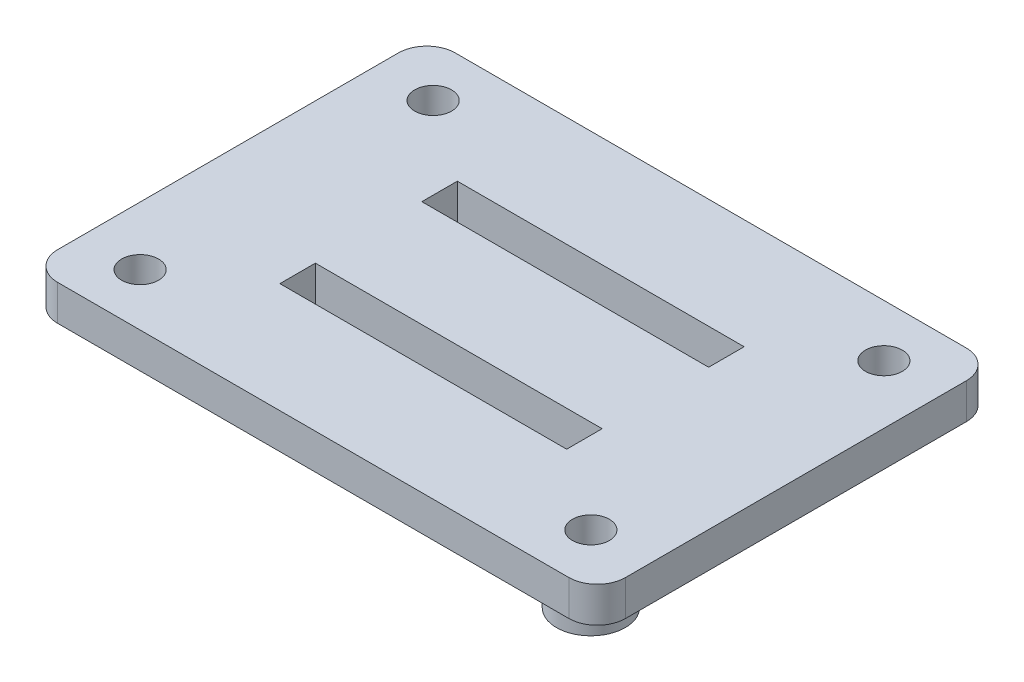
ISO-10303-21;
HEADER;
FILE_DESCRIPTION(('STEP AP214'),'2;1');
FILE_NAME('part.step','',(''),(''),'','','');
FILE_SCHEMA(('AUTOMOTIVE_DESIGN { 1 0 10303 214 1 1 1 1 }'));
ENDSEC;
DATA;
#1=APPLICATION_CONTEXT('core data for automotive mechanical design processes');
#2=APPLICATION_PROTOCOL_DEFINITION('international standard','automotive_design',2000,#1);
#3=PRODUCT_CONTEXT('',#1,'mechanical');
#4=PRODUCT('Part','Part','',(#3));
#5=PRODUCT_RELATED_PRODUCT_CATEGORY('part','',(#4));
#6=PRODUCT_DEFINITION_FORMATION('','',#4);
#7=PRODUCT_DEFINITION_CONTEXT('part definition',#1,'design');
#8=PRODUCT_DEFINITION('design','',#6,#7);
#9=PRODUCT_DEFINITION_SHAPE('','',#8);
#10=(LENGTH_UNIT() NAMED_UNIT(*) SI_UNIT(.MILLI.,.METRE.));
#11=(NAMED_UNIT(*) PLANE_ANGLE_UNIT() SI_UNIT($,.RADIAN.));
#12=(NAMED_UNIT(*) SI_UNIT($,.STERADIAN.) SOLID_ANGLE_UNIT());
#13=UNCERTAINTY_MEASURE_WITH_UNIT(LENGTH_MEASURE(1.E-05),#10,'distance_accuracy_value','');
#14=(GEOMETRIC_REPRESENTATION_CONTEXT(3) GLOBAL_UNCERTAINTY_ASSIGNED_CONTEXT((#13)) GLOBAL_UNIT_ASSIGNED_CONTEXT((#10,
#11,#12)) REPRESENTATION_CONTEXT('',''));
#15=CARTESIAN_POINT('',(0.,0.,0.));
#16=DIRECTION('',(0.,0.,1.));
#17=DIRECTION('',(1.,0.,0.));
#18=AXIS2_PLACEMENT_3D('',#15,#16,#17);
#19=CARTESIAN_POINT('',(40.,5.,28.));
#20=DIRECTION('',(-1.,0.,0.));
#21=DIRECTION('',(0.,0.,1.));
#22=AXIS2_PLACEMENT_3D('',#19,#20,#21);
#23=PLANE('',#22);
#24=DIRECTION('',(0.,0.,-1.));
#25=VECTOR('',#24,1.);
#26=CARTESIAN_POINT('',(40.,0.,28.));
#27=LINE('',#26,#25);
#28=CARTESIAN_POINT('',(40.,0.,24.));
#29=VERTEX_POINT('',#28);
#30=CARTESIAN_POINT('',(40.,0.,-24.));
#31=VERTEX_POINT('',#30);
#32=EDGE_CURVE('E246',#29,#31,#27,.T.);
#33=ORIENTED_EDGE('',*,*,#32,.T.);
#34=DIRECTION('',(0.,-1.,0.));
#35=VECTOR('',#34,1.);
#36=CARTESIAN_POINT('',(40.,5.,-24.));
#37=LINE('',#36,#35);
#38=CARTESIAN_POINT('',(40.,5.,-24.));
#39=VERTEX_POINT('',#38);
#40=EDGE_CURVE('E295',#31,#39,#37,.F.);
#41=ORIENTED_EDGE('',*,*,#40,.T.);
#42=DIRECTION('',(0.,0.,-1.));
#43=VECTOR('',#42,1.);
#44=CARTESIAN_POINT('',(40.,5.,28.));
#45=LINE('',#44,#43);
#46=CARTESIAN_POINT('',(40.,5.,24.));
#47=VERTEX_POINT('',#46);
#48=EDGE_CURVE('E247',#47,#39,#45,.T.);
#49=ORIENTED_EDGE('',*,*,#48,.F.);
#50=DIRECTION('',(0.,-1.,0.));
#51=VECTOR('',#50,1.);
#52=CARTESIAN_POINT('',(40.,5.,24.));
#53=LINE('',#52,#51);
#54=EDGE_CURVE('E292',#47,#29,#53,.T.);
#55=ORIENTED_EDGE('',*,*,#54,.T.);
#56=EDGE_LOOP('',(#33,#41,#49,#55));
#57=FACE_BOUND('',#56,.T.);
#58=ADVANCED_FACE('F45',(#57),#23,.F.);
#59=CARTESIAN_POINT('',(-40.,5.,-28.));
#60=DIRECTION('',(0.,0.,1.));
#61=DIRECTION('',(1.,0.,0.));
#62=AXIS2_PLACEMENT_3D('',#59,#60,#61);
#63=PLANE('',#62);
#64=DIRECTION('',(-1.,0.,0.));
#65=VECTOR('',#64,1.);
#66=CARTESIAN_POINT('',(-40.,0.,-28.));
#67=LINE('',#66,#65);
#68=CARTESIAN_POINT('',(36.,0.,-28.));
#69=VERTEX_POINT('',#68);
#70=CARTESIAN_POINT('',(-36.,0.,-28.));
#71=VERTEX_POINT('',#70);
#72=EDGE_CURVE('E261',#69,#71,#67,.T.);
#73=ORIENTED_EDGE('',*,*,#72,.T.);
#74=DIRECTION('',(0.,-1.,0.));
#75=VECTOR('',#74,1.);
#76=CARTESIAN_POINT('',(-36.,5.,-28.));
#77=LINE('',#76,#75);
#78=CARTESIAN_POINT('',(-36.,5.,-28.));
#79=VERTEX_POINT('',#78);
#80=EDGE_CURVE('E283',#71,#79,#77,.F.);
#81=ORIENTED_EDGE('',*,*,#80,.T.);
#82=DIRECTION('',(-1.,0.,0.));
#83=VECTOR('',#82,1.);
#84=CARTESIAN_POINT('',(-40.,5.,-28.));
#85=LINE('',#84,#83);
#86=CARTESIAN_POINT('',(36.,5.,-28.));
#87=VERTEX_POINT('',#86);
#88=EDGE_CURVE('E250',#87,#79,#85,.T.);
#89=ORIENTED_EDGE('',*,*,#88,.F.);
#90=DIRECTION('',(0.,-1.,0.));
#91=VECTOR('',#90,1.);
#92=CARTESIAN_POINT('',(36.,5.,-28.));
#93=LINE('',#92,#91);
#94=EDGE_CURVE('E280',#87,#69,#93,.T.);
#95=ORIENTED_EDGE('',*,*,#94,.T.);
#96=EDGE_LOOP('',(#73,#81,#89,#95));
#97=FACE_BOUND('',#96,.T.);
#98=ADVANCED_FACE('F319',(#97),#63,.F.);
#99=CARTESIAN_POINT('',(-40.,5.,28.));
#100=DIRECTION('',(1.,0.,0.));
#101=DIRECTION('',(0.,0.,-1.));
#102=AXIS2_PLACEMENT_3D('',#99,#100,#101);
#103=PLANE('',#102);
#104=DIRECTION('',(0.,0.,1.));
#105=VECTOR('',#104,1.);
#106=CARTESIAN_POINT('',(-40.,5.,28.));
#107=LINE('',#106,#105);
#108=CARTESIAN_POINT('',(-40.,5.,-24.));
#109=VERTEX_POINT('',#108);
#110=CARTESIAN_POINT('',(-40.,5.,24.));
#111=VERTEX_POINT('',#110);
#112=EDGE_CURVE('E254',#109,#111,#107,.T.);
#113=ORIENTED_EDGE('',*,*,#112,.F.);
#114=DIRECTION('',(0.,-1.,0.));
#115=VECTOR('',#114,1.);
#116=CARTESIAN_POINT('',(-40.,5.,-24.));
#117=LINE('',#116,#115);
#118=CARTESIAN_POINT('',(-40.,0.,-24.));
#119=VERTEX_POINT('',#118);
#120=EDGE_CURVE('E269',#109,#119,#117,.T.);
#121=ORIENTED_EDGE('',*,*,#120,.T.);
#122=DIRECTION('',(0.,0.,1.));
#123=VECTOR('',#122,1.);
#124=CARTESIAN_POINT('',(-40.,0.,28.));
#125=LINE('',#124,#123);
#126=CARTESIAN_POINT('',(-40.,0.,24.));
#127=VERTEX_POINT('',#126);
#128=EDGE_CURVE('E264',#119,#127,#125,.T.);
#129=ORIENTED_EDGE('',*,*,#128,.T.);
#130=DIRECTION('',(0.,-1.,0.));
#131=VECTOR('',#130,1.);
#132=CARTESIAN_POINT('',(-40.,5.,24.));
#133=LINE('',#132,#131);
#134=EDGE_CURVE('E258',#127,#111,#133,.F.);
#135=ORIENTED_EDGE('',*,*,#134,.T.);
#136=EDGE_LOOP('',(#113,#121,#129,#135));
#137=FACE_BOUND('',#136,.T.);
#138=ADVANCED_FACE('F327',(#137),#103,.F.);
#139=CARTESIAN_POINT('',(-40.,5.,28.));
#140=DIRECTION('',(0.,0.,-1.));
#141=DIRECTION('',(-1.,0.,0.));
#142=AXIS2_PLACEMENT_3D('',#139,#140,#141);
#143=PLANE('',#142);
#144=DIRECTION('',(1.,0.,0.));
#145=VECTOR('',#144,1.);
#146=CARTESIAN_POINT('',(-40.,0.,28.));
#147=LINE('',#146,#145);
#148=CARTESIAN_POINT('',(-36.,0.,28.));
#149=VERTEX_POINT('',#148);
#150=CARTESIAN_POINT('',(36.,0.,28.));
#151=VERTEX_POINT('',#150);
#152=EDGE_CURVE('E251',#149,#151,#147,.T.);
#153=ORIENTED_EDGE('',*,*,#152,.T.);
#154=DIRECTION('',(0.,-1.,0.));
#155=VECTOR('',#154,1.);
#156=CARTESIAN_POINT('',(36.,5.,28.));
#157=LINE('',#156,#155);
#158=CARTESIAN_POINT('',(36.,5.,28.));
#159=VERTEX_POINT('',#158);
#160=EDGE_CURVE('E11',#151,#159,#157,.F.);
#161=ORIENTED_EDGE('',*,*,#160,.T.);
#162=DIRECTION('',(1.,0.,0.));
#163=VECTOR('',#162,1.);
#164=CARTESIAN_POINT('',(-40.,5.,28.));
#165=LINE('',#164,#163);
#166=CARTESIAN_POINT('',(-36.,5.,28.));
#167=VERTEX_POINT('',#166);
#168=EDGE_CURVE('E256',#167,#159,#165,.T.);
#169=ORIENTED_EDGE('',*,*,#168,.F.);
#170=DIRECTION('',(0.,-1.,0.));
#171=VECTOR('',#170,1.);
#172=CARTESIAN_POINT('',(-36.,5.,28.));
#173=LINE('',#172,#171);
#174=EDGE_CURVE('E53',#167,#149,#173,.T.);
#175=ORIENTED_EDGE('',*,*,#174,.T.);
#176=EDGE_LOOP('',(#153,#161,#169,#175));
#177=FACE_BOUND('',#176,.T.);
#178=ADVANCED_FACE('F299',(#177),#143,.F.);
#179=CARTESIAN_POINT('',(0.,5.,0.));
#180=DIRECTION('',(0.,-1.,0.));
#181=DIRECTION('',(0.,0.,-1.));
#182=AXIS2_PLACEMENT_3D('',#179,#180,#181);
#183=PLANE('',#182);
#184=DIRECTION('',(-1.,0.,0.));
#185=VECTOR('',#184,1.);
#186=CARTESIAN_POINT('',(-20.2,5.,-7.5));
#187=LINE('',#186,#185);
#188=CARTESIAN_POINT('',(20.2,5.,-7.5));
#189=VERTEX_POINT('',#188);
#190=CARTESIAN_POINT('',(-20.2,5.,-7.5));
#191=VERTEX_POINT('',#190);
#192=EDGE_CURVE('E196',#189,#191,#187,.T.);
#193=ORIENTED_EDGE('',*,*,#192,.T.);
#194=DIRECTION('',(0.,0.,-1.));
#195=VECTOR('',#194,1.);
#196=CARTESIAN_POINT('',(-20.2,5.,-12.5));
#197=LINE('',#196,#195);
#198=CARTESIAN_POINT('',(-20.2,5.,-12.5));
#199=VERTEX_POINT('',#198);
#200=EDGE_CURVE('E200',#191,#199,#197,.T.);
#201=ORIENTED_EDGE('',*,*,#200,.T.);
#202=DIRECTION('',(1.,0.,0.));
#203=VECTOR('',#202,1.);
#204=CARTESIAN_POINT('',(-20.2,5.,-12.5));
#205=LINE('',#204,#203);
#206=CARTESIAN_POINT('',(20.2,5.,-12.5));
#207=VERTEX_POINT('',#206);
#208=EDGE_CURVE('E223',#199,#207,#205,.T.);
#209=ORIENTED_EDGE('',*,*,#208,.T.);
#210=DIRECTION('',(0.,0.,1.));
#211=VECTOR('',#210,1.);
#212=CARTESIAN_POINT('',(20.2,5.,-12.5));
#213=LINE('',#212,#211);
#214=EDGE_CURVE('E220',#207,#189,#213,.T.);
#215=ORIENTED_EDGE('',*,*,#214,.T.);
#216=EDGE_LOOP('',(#193,#201,#209,#215));
#217=FACE_BOUND('',#216,.T.);
#218=CARTESIAN_POINT('',(-31.75,5.,20.6375));
#219=DIRECTION('',(0.,-1.,0.));
#220=DIRECTION('',(0.,0.,-1.));
#221=AXIS2_PLACEMENT_3D('',#218,#219,#220);
#222=CIRCLE('',#221,2.6);
#223=CARTESIAN_POINT('',(-31.75,5.,18.0375));
#224=VERTEX_POINT('',#223);
#225=EDGE_CURVE('E188',#224,#224,#222,.T.);
#226=ORIENTED_EDGE('',*,*,#225,.T.);
#227=EDGE_LOOP('',(#226));
#228=FACE_BOUND('',#227,.T.);
#229=CARTESIAN_POINT('',(31.75,5.,20.6375));
#230=DIRECTION('',(0.,-1.,0.));
#231=DIRECTION('',(0.,0.,-1.));
#232=AXIS2_PLACEMENT_3D('',#229,#230,#231);
#233=CIRCLE('',#232,2.6);
#234=CARTESIAN_POINT('',(31.75,5.,18.0375));
#235=VERTEX_POINT('',#234);
#236=EDGE_CURVE('E195',#235,#235,#233,.T.);
#237=ORIENTED_EDGE('',*,*,#236,.T.);
#238=EDGE_LOOP('',(#237));
#239=FACE_BOUND('',#238,.T.);
#240=CARTESIAN_POINT('',(-31.75,5.,-20.6375));
#241=DIRECTION('',(0.,-1.,0.));
#242=DIRECTION('',(0.,0.,-1.));
#243=AXIS2_PLACEMENT_3D('',#240,#241,#242);
#244=CIRCLE('',#243,2.6);
#245=CARTESIAN_POINT('',(-31.75,5.,-23.2375));
#246=VERTEX_POINT('',#245);
#247=EDGE_CURVE('E229',#246,#246,#244,.T.);
#248=ORIENTED_EDGE('',*,*,#247,.T.);
#249=EDGE_LOOP('',(#248));
#250=FACE_BOUND('',#249,.T.);
#251=DIRECTION('',(1.,0.,0.));
#252=VECTOR('',#251,1.);
#253=CARTESIAN_POINT('',(-20.2,5.,7.5));
#254=LINE('',#253,#252);
#255=CARTESIAN_POINT('',(-20.2,5.,7.5));
#256=VERTEX_POINT('',#255);
#257=CARTESIAN_POINT('',(20.2,5.,7.5));
#258=VERTEX_POINT('',#257);
#259=EDGE_CURVE('E183',#256,#258,#254,.T.);
#260=ORIENTED_EDGE('',*,*,#259,.T.);
#261=DIRECTION('',(0.,0.,1.));
#262=VECTOR('',#261,1.);
#263=CARTESIAN_POINT('',(20.2,5.,12.5));
#264=LINE('',#263,#262);
#265=CARTESIAN_POINT('',(20.2,5.,12.5));
#266=VERTEX_POINT('',#265);
#267=EDGE_CURVE('E168',#258,#266,#264,.T.);
#268=ORIENTED_EDGE('',*,*,#267,.T.);
#269=DIRECTION('',(-1.,0.,0.));
#270=VECTOR('',#269,1.);
#271=CARTESIAN_POINT('',(-20.2,5.,12.5));
#272=LINE('',#271,#270);
#273=CARTESIAN_POINT('',(-20.2,5.,12.5));
#274=VERTEX_POINT('',#273);
#275=EDGE_CURVE('E158',#266,#274,#272,.T.);
#276=ORIENTED_EDGE('',*,*,#275,.T.);
#277=DIRECTION('',(0.,0.,-1.));
#278=VECTOR('',#277,1.);
#279=CARTESIAN_POINT('',(-20.2,5.,12.5));
#280=LINE('',#279,#278);
#281=EDGE_CURVE('E169',#274,#256,#280,.T.);
#282=ORIENTED_EDGE('',*,*,#281,.T.);
#283=EDGE_LOOP('',(#260,#268,#276,#282));
#284=FACE_BOUND('',#283,.T.);
#285=CARTESIAN_POINT('',(31.75,5.,-20.6375));
#286=DIRECTION('',(0.,-1.,0.));
#287=DIRECTION('',(0.,0.,-1.));
#288=AXIS2_PLACEMENT_3D('',#285,#286,#287);
#289=CIRCLE('',#288,2.6);
#290=CARTESIAN_POINT('',(31.75,5.,-23.2375));
#291=VERTEX_POINT('',#290);
#292=EDGE_CURVE('E243',#291,#291,#289,.T.);
#293=ORIENTED_EDGE('',*,*,#292,.T.);
#294=EDGE_LOOP('',(#293));
#295=FACE_BOUND('',#294,.T.);
#296=ORIENTED_EDGE('',*,*,#88,.T.);
#297=CARTESIAN_POINT('',(-36.,5.,-24.));
#298=DIRECTION('',(0.,-1.,0.));
#299=DIRECTION('',(0.,0.,-1.));
#300=AXIS2_PLACEMENT_3D('',#297,#298,#299);
#301=CIRCLE('',#300,4.);
#302=EDGE_CURVE('E290',#79,#109,#301,.F.);
#303=ORIENTED_EDGE('',*,*,#302,.T.);
#304=ORIENTED_EDGE('',*,*,#112,.T.);
#305=CARTESIAN_POINT('',(-36.,5.,24.));
#306=DIRECTION('',(0.,-1.,0.));
#307=DIRECTION('',(0.,0.,-1.));
#308=AXIS2_PLACEMENT_3D('',#305,#306,#307);
#309=CIRCLE('',#308,4.);
#310=EDGE_CURVE('E65',#111,#167,#309,.F.);
#311=ORIENTED_EDGE('',*,*,#310,.T.);
#312=ORIENTED_EDGE('',*,*,#168,.T.);
#313=CARTESIAN_POINT('',(36.,5.,24.));
#314=DIRECTION('',(0.,-1.,0.));
#315=DIRECTION('',(0.,0.,-1.));
#316=AXIS2_PLACEMENT_3D('',#313,#314,#315);
#317=CIRCLE('',#316,4.);
#318=EDGE_CURVE('E286',#159,#47,#317,.F.);
#319=ORIENTED_EDGE('',*,*,#318,.T.);
#320=ORIENTED_EDGE('',*,*,#48,.T.);
#321=CARTESIAN_POINT('',(36.,5.,-24.));
#322=DIRECTION('',(0.,-1.,0.));
#323=DIRECTION('',(0.,0.,-1.));
#324=AXIS2_PLACEMENT_3D('',#321,#322,#323);
#325=CIRCLE('',#324,4.);
#326=EDGE_CURVE('E288',#39,#87,#325,.F.);
#327=ORIENTED_EDGE('',*,*,#326,.T.);
#328=EDGE_LOOP('',(#296,#303,#304,#311,#312,#319,#320,#327));
#329=FACE_BOUND('',#328,.T.);
#330=ADVANCED_FACE('F180',(#217,#228,#239,#250,#284,#295,#329),#183,.F.);
#331=CARTESIAN_POINT('',(0.,0.,0.));
#332=DIRECTION('',(0.,-1.,0.));
#333=DIRECTION('',(0.,0.,-1.));
#334=AXIS2_PLACEMENT_3D('',#331,#332,#333);
#335=PLANE('',#334);
#336=CARTESIAN_POINT('',(31.75,0.,20.6375));
#337=DIRECTION('',(0.,-1.,0.));
#338=DIRECTION('',(0.,0.,-1.));
#339=AXIS2_PLACEMENT_3D('',#336,#337,#338);
#340=CIRCLE('',#339,4.85);
#341=CARTESIAN_POINT('',(31.75,0.,15.7875));
#342=VERTEX_POINT('',#341);
#343=EDGE_CURVE('E567',#342,#342,#340,.T.);
#344=ORIENTED_EDGE('',*,*,#343,.F.);
#345=EDGE_LOOP('',(#344));
#346=FACE_BOUND('',#345,.T.);
#347=DIRECTION('',(0.,0.,1.));
#348=VECTOR('',#347,1.);
#349=CARTESIAN_POINT('',(-20.2,0.,-12.5));
#350=LINE('',#349,#348);
#351=CARTESIAN_POINT('',(-20.2,0.,-12.5));
#352=VERTEX_POINT('',#351);
#353=CARTESIAN_POINT('',(-20.2,0.,-7.5));
#354=VERTEX_POINT('',#353);
#355=EDGE_CURVE('E212',#352,#354,#350,.T.);
#356=ORIENTED_EDGE('',*,*,#355,.T.);
#357=DIRECTION('',(1.,0.,0.));
#358=VECTOR('',#357,1.);
#359=CARTESIAN_POINT('',(-20.2,0.,-7.5));
#360=LINE('',#359,#358);
#361=CARTESIAN_POINT('',(20.2,0.,-7.5));
#362=VERTEX_POINT('',#361);
#363=EDGE_CURVE('E209',#354,#362,#360,.T.);
#364=ORIENTED_EDGE('',*,*,#363,.T.);
#365=DIRECTION('',(0.,0.,-1.));
#366=VECTOR('',#365,1.);
#367=CARTESIAN_POINT('',(20.2,0.,-12.5));
#368=LINE('',#367,#366);
#369=CARTESIAN_POINT('',(20.2,0.,-12.5));
#370=VERTEX_POINT('',#369);
#371=EDGE_CURVE('E192',#362,#370,#368,.T.);
#372=ORIENTED_EDGE('',*,*,#371,.T.);
#373=DIRECTION('',(-1.,0.,0.));
#374=VECTOR('',#373,1.);
#375=CARTESIAN_POINT('',(-20.2,0.,-12.5));
#376=LINE('',#375,#374);
#377=EDGE_CURVE('E215',#370,#352,#376,.T.);
#378=ORIENTED_EDGE('',*,*,#377,.T.);
#379=EDGE_LOOP('',(#356,#364,#372,#378));
#380=FACE_BOUND('',#379,.T.);
#381=CARTESIAN_POINT('',(-31.75,0.,20.6375));
#382=DIRECTION('',(0.,1.,0.));
#383=DIRECTION('',(0.,0.,-1.));
#384=AXIS2_PLACEMENT_3D('',#381,#382,#383);
#385=CIRCLE('',#384,2.6);
#386=CARTESIAN_POINT('',(-31.75,0.,18.0375));
#387=VERTEX_POINT('',#386);
#388=EDGE_CURVE('E191',#387,#387,#385,.T.);
#389=ORIENTED_EDGE('',*,*,#388,.T.);
#390=EDGE_LOOP('',(#389));
#391=FACE_BOUND('',#390,.T.);
#392=CARTESIAN_POINT('',(-31.75,0.,-20.6375));
#393=DIRECTION('',(0.,1.,0.));
#394=DIRECTION('',(0.,0.,1.));
#395=AXIS2_PLACEMENT_3D('',#392,#393,#394);
#396=CIRCLE('',#395,2.6);
#397=CARTESIAN_POINT('',(-31.75,0.,-18.0375));
#398=VERTEX_POINT('',#397);
#399=EDGE_CURVE('E232',#398,#398,#396,.T.);
#400=ORIENTED_EDGE('',*,*,#399,.T.);
#401=EDGE_LOOP('',(#400));
#402=FACE_BOUND('',#401,.T.);
#403=DIRECTION('',(0.,0.,-1.));
#404=VECTOR('',#403,1.);
#405=CARTESIAN_POINT('',(20.2,0.,12.5));
#406=LINE('',#405,#404);
#407=CARTESIAN_POINT('',(20.2,0.,12.5));
#408=VERTEX_POINT('',#407);
#409=CARTESIAN_POINT('',(20.2,0.,7.5));
#410=VERTEX_POINT('',#409);
#411=EDGE_CURVE('E175',#408,#410,#406,.T.);
#412=ORIENTED_EDGE('',*,*,#411,.T.);
#413=DIRECTION('',(-1.,0.,0.));
#414=VECTOR('',#413,1.);
#415=CARTESIAN_POINT('',(-20.2,0.,7.5));
#416=LINE('',#415,#414);
#417=CARTESIAN_POINT('',(-20.2,0.,7.5));
#418=VERTEX_POINT('',#417);
#419=EDGE_CURVE('E557',#410,#418,#416,.T.);
#420=ORIENTED_EDGE('',*,*,#419,.T.);
#421=DIRECTION('',(0.,0.,1.));
#422=VECTOR('',#421,1.);
#423=CARTESIAN_POINT('',(-20.2,0.,12.5));
#424=LINE('',#423,#422);
#425=CARTESIAN_POINT('',(-20.2,0.,12.5));
#426=VERTEX_POINT('',#425);
#427=EDGE_CURVE('E224',#418,#426,#424,.T.);
#428=ORIENTED_EDGE('',*,*,#427,.T.);
#429=DIRECTION('',(1.,0.,0.));
#430=VECTOR('',#429,1.);
#431=CARTESIAN_POINT('',(-20.2,0.,12.5));
#432=LINE('',#431,#430);
#433=EDGE_CURVE('E558',#426,#408,#432,.T.);
#434=ORIENTED_EDGE('',*,*,#433,.T.);
#435=EDGE_LOOP('',(#412,#420,#428,#434));
#436=FACE_BOUND('',#435,.T.);
#437=CARTESIAN_POINT('',(31.75,0.,-20.6375));
#438=DIRECTION('',(0.,1.,0.));
#439=DIRECTION('',(0.,0.,-1.));
#440=AXIS2_PLACEMENT_3D('',#437,#438,#439);
#441=CIRCLE('',#440,2.6);
#442=CARTESIAN_POINT('',(31.75,0.,-23.2375));
#443=VERTEX_POINT('',#442);
#444=EDGE_CURVE('E236',#443,#443,#441,.T.);
#445=ORIENTED_EDGE('',*,*,#444,.T.);
#446=EDGE_LOOP('',(#445));
#447=FACE_BOUND('',#446,.T.);
#448=ORIENTED_EDGE('',*,*,#128,.F.);
#449=CARTESIAN_POINT('',(-36.,0.,-24.));
#450=DIRECTION('',(0.,-1.,0.));
#451=DIRECTION('',(0.,0.,-1.));
#452=AXIS2_PLACEMENT_3D('',#449,#450,#451);
#453=CIRCLE('',#452,4.);
#454=EDGE_CURVE('E278',#119,#71,#453,.T.);
#455=ORIENTED_EDGE('',*,*,#454,.T.);
#456=ORIENTED_EDGE('',*,*,#72,.F.);
#457=CARTESIAN_POINT('',(36.,0.,-24.));
#458=DIRECTION('',(0.,-1.,0.));
#459=DIRECTION('',(0.,0.,-1.));
#460=AXIS2_PLACEMENT_3D('',#457,#458,#459);
#461=CIRCLE('',#460,4.);
#462=EDGE_CURVE('E276',#69,#31,#461,.T.);
#463=ORIENTED_EDGE('',*,*,#462,.T.);
#464=ORIENTED_EDGE('',*,*,#32,.F.);
#465=CARTESIAN_POINT('',(36.,0.,24.));
#466=DIRECTION('',(0.,-1.,0.));
#467=DIRECTION('',(0.,0.,-1.));
#468=AXIS2_PLACEMENT_3D('',#465,#466,#467);
#469=CIRCLE('',#468,4.);
#470=EDGE_CURVE('E274',#29,#151,#469,.T.);
#471=ORIENTED_EDGE('',*,*,#470,.T.);
#472=ORIENTED_EDGE('',*,*,#152,.F.);
#473=CARTESIAN_POINT('',(-36.,0.,24.));
#474=DIRECTION('',(0.,-1.,0.));
#475=DIRECTION('',(0.,0.,-1.));
#476=AXIS2_PLACEMENT_3D('',#473,#474,#475);
#477=CIRCLE('',#476,4.);
#478=EDGE_CURVE('E272',#149,#127,#477,.T.);
#479=ORIENTED_EDGE('',*,*,#478,.T.);
#480=EDGE_LOOP('',(#448,#455,#456,#463,#464,#471,#472,#479));
#481=FACE_BOUND('',#480,.T.);
#482=ADVANCED_FACE('F303',(#346,#380,#391,#402,#436,#447,#481),#335,.T.);
#483=CARTESIAN_POINT('',(31.75,45.708230126106,-20.6375));
#484=DIRECTION('',(0.,-1.,0.));
#485=DIRECTION('',(0.,0.,-1.));
#486=AXIS2_PLACEMENT_3D('',#483,#484,#485);
#487=CYLINDRICAL_SURFACE('',#486,2.6);
#488=ORIENTED_EDGE('',*,*,#292,.F.);
#489=EDGE_LOOP('',(#488));
#490=FACE_BOUND('',#489,.T.);
#491=ORIENTED_EDGE('',*,*,#444,.F.);
#492=EDGE_LOOP('',(#491));
#493=FACE_BOUND('',#492,.T.);
#494=ADVANCED_FACE('F486',(#490,#493),#487,.F.);
#495=CARTESIAN_POINT('',(-20.2,45.708230126106,7.5));
#496=DIRECTION('',(0.,0.,1.));
#497=DIRECTION('',(1.,0.,0.));
#498=AXIS2_PLACEMENT_3D('',#495,#496,#497);
#499=PLANE('',#498);
#500=DIRECTION('',(0.,-1.,0.));
#501=VECTOR('',#500,1.);
#502=CARTESIAN_POINT('',(-20.2,45.708230126106,7.5));
#503=LINE('',#502,#501);
#504=EDGE_CURVE('E561',#256,#418,#503,.T.);
#505=ORIENTED_EDGE('',*,*,#504,.T.);
#506=ORIENTED_EDGE('',*,*,#419,.F.);
#507=DIRECTION('',(0.,-1.,0.));
#508=VECTOR('',#507,1.);
#509=CARTESIAN_POINT('',(20.2,45.708230126106,7.5));
#510=LINE('',#509,#508);
#511=EDGE_CURVE('E177',#258,#410,#510,.T.);
#512=ORIENTED_EDGE('',*,*,#511,.F.);
#513=ORIENTED_EDGE('',*,*,#259,.F.);
#514=EDGE_LOOP('',(#505,#506,#512,#513));
#515=FACE_BOUND('',#514,.T.);
#516=ADVANCED_FACE('F478',(#515),#499,.T.);
#517=CARTESIAN_POINT('',(20.2,45.708230126106,12.5));
#518=DIRECTION('',(-1.,0.,0.));
#519=DIRECTION('',(0.,0.,1.));
#520=AXIS2_PLACEMENT_3D('',#517,#518,#519);
#521=PLANE('',#520);
#522=ORIENTED_EDGE('',*,*,#511,.T.);
#523=ORIENTED_EDGE('',*,*,#411,.F.);
#524=DIRECTION('',(0.,-1.,0.));
#525=VECTOR('',#524,1.);
#526=CARTESIAN_POINT('',(20.2,45.708230126106,12.5));
#527=LINE('',#526,#525);
#528=EDGE_CURVE('E161',#266,#408,#527,.T.);
#529=ORIENTED_EDGE('',*,*,#528,.F.);
#530=ORIENTED_EDGE('',*,*,#267,.F.);
#531=EDGE_LOOP('',(#522,#523,#529,#530));
#532=FACE_BOUND('',#531,.T.);
#533=ADVANCED_FACE('F172',(#532),#521,.T.);
#534=CARTESIAN_POINT('',(-20.2,45.708230126106,12.5));
#535=DIRECTION('',(0.,0.,-1.));
#536=DIRECTION('',(-1.,0.,0.));
#537=AXIS2_PLACEMENT_3D('',#534,#535,#536);
#538=PLANE('',#537);
#539=ORIENTED_EDGE('',*,*,#528,.T.);
#540=ORIENTED_EDGE('',*,*,#433,.F.);
#541=DIRECTION('',(0.,-1.,0.));
#542=VECTOR('',#541,1.);
#543=CARTESIAN_POINT('',(-20.2,45.708230126106,12.5));
#544=LINE('',#543,#542);
#545=EDGE_CURVE('E164',#274,#426,#544,.T.);
#546=ORIENTED_EDGE('',*,*,#545,.F.);
#547=ORIENTED_EDGE('',*,*,#275,.F.);
#548=EDGE_LOOP('',(#539,#540,#546,#547));
#549=FACE_BOUND('',#548,.T.);
#550=ADVANCED_FACE('F160',(#549),#538,.T.);
#551=CARTESIAN_POINT('',(-20.2,45.708230126106,12.5));
#552=DIRECTION('',(1.,0.,0.));
#553=DIRECTION('',(0.,0.,-1.));
#554=AXIS2_PLACEMENT_3D('',#551,#552,#553);
#555=PLANE('',#554);
#556=ORIENTED_EDGE('',*,*,#545,.T.);
#557=ORIENTED_EDGE('',*,*,#427,.F.);
#558=ORIENTED_EDGE('',*,*,#504,.F.);
#559=ORIENTED_EDGE('',*,*,#281,.F.);
#560=EDGE_LOOP('',(#556,#557,#558,#559));
#561=FACE_BOUND('',#560,.T.);
#562=ADVANCED_FACE('F454',(#561),#555,.T.);
#563=CARTESIAN_POINT('',(-31.75,45.708230126106,-20.6375));
#564=DIRECTION('',(0.,-1.,0.));
#565=DIRECTION('',(0.,0.,-1.));
#566=AXIS2_PLACEMENT_3D('',#563,#564,#565);
#567=CYLINDRICAL_SURFACE('',#566,2.6);
#568=ORIENTED_EDGE('',*,*,#247,.F.);
#569=EDGE_LOOP('',(#568));
#570=FACE_BOUND('',#569,.T.);
#571=ORIENTED_EDGE('',*,*,#399,.F.);
#572=EDGE_LOOP('',(#571));
#573=FACE_BOUND('',#572,.T.);
#574=ADVANCED_FACE('F445',(#570,#573),#567,.F.);
#575=CARTESIAN_POINT('',(31.75,45.708230126106,20.6375));
#576=DIRECTION('',(0.,-1.,0.));
#577=DIRECTION('',(0.,0.,-1.));
#578=AXIS2_PLACEMENT_3D('',#575,#576,#577);
#579=CYLINDRICAL_SURFACE('',#578,2.6);
#580=ORIENTED_EDGE('',*,*,#236,.F.);
#581=EDGE_LOOP('',(#580));
#582=FACE_BOUND('',#581,.T.);
#583=CARTESIAN_POINT('',(31.75,0.,20.6375));
#584=DIRECTION('',(0.,1.,0.));
#585=DIRECTION('',(0.,0.,1.));
#586=AXIS2_PLACEMENT_3D('',#583,#584,#585);
#587=CIRCLE('',#586,2.6);
#588=CARTESIAN_POINT('',(31.75,0.,23.2375));
#589=VERTEX_POINT('',#588);
#590=EDGE_CURVE('E233',#589,#589,#587,.T.);
#591=ORIENTED_EDGE('',*,*,#590,.F.);
#592=EDGE_LOOP('',(#591));
#593=FACE_BOUND('',#592,.T.);
#594=ADVANCED_FACE('F436',(#582,#593),#579,.F.);
#595=CARTESIAN_POINT('',(-31.75,45.708230126106,20.6375));
#596=DIRECTION('',(0.,-1.,0.));
#597=DIRECTION('',(0.,0.,-1.));
#598=AXIS2_PLACEMENT_3D('',#595,#596,#597);
#599=CYLINDRICAL_SURFACE('',#598,2.6);
#600=ORIENTED_EDGE('',*,*,#225,.F.);
#601=EDGE_LOOP('',(#600));
#602=FACE_BOUND('',#601,.T.);
#603=ORIENTED_EDGE('',*,*,#388,.F.);
#604=EDGE_LOOP('',(#603));
#605=FACE_BOUND('',#604,.T.);
#606=ADVANCED_FACE('F427',(#602,#605),#599,.F.);
#607=CARTESIAN_POINT('',(-20.2,45.708230126106,-7.5));
#608=DIRECTION('',(0.,0.,-1.));
#609=DIRECTION('',(-1.,0.,0.));
#610=AXIS2_PLACEMENT_3D('',#607,#608,#609);
#611=PLANE('',#610);
#612=DIRECTION('',(0.,-1.,0.));
#613=VECTOR('',#612,1.);
#614=CARTESIAN_POINT('',(20.2,45.708230126106,-7.5));
#615=LINE('',#614,#613);
#616=EDGE_CURVE('E207',#189,#362,#615,.T.);
#617=ORIENTED_EDGE('',*,*,#616,.T.);
#618=ORIENTED_EDGE('',*,*,#363,.F.);
#619=DIRECTION('',(0.,-1.,0.));
#620=VECTOR('',#619,1.);
#621=CARTESIAN_POINT('',(-20.2,45.708230126106,-7.5));
#622=LINE('',#621,#620);
#623=EDGE_CURVE('E205',#191,#354,#622,.T.);
#624=ORIENTED_EDGE('',*,*,#623,.F.);
#625=ORIENTED_EDGE('',*,*,#192,.F.);
#626=EDGE_LOOP('',(#617,#618,#624,#625));
#627=FACE_BOUND('',#626,.T.);
#628=ADVANCED_FACE('F418',(#627),#611,.T.);
#629=CARTESIAN_POINT('',(-20.2,45.708230126106,-12.5));
#630=DIRECTION('',(1.,0.,0.));
#631=DIRECTION('',(0.,0.,-1.));
#632=AXIS2_PLACEMENT_3D('',#629,#630,#631);
#633=PLANE('',#632);
#634=ORIENTED_EDGE('',*,*,#623,.T.);
#635=ORIENTED_EDGE('',*,*,#355,.F.);
#636=DIRECTION('',(0.,-1.,0.));
#637=VECTOR('',#636,1.);
#638=CARTESIAN_POINT('',(-20.2,45.708230126106,-12.5));
#639=LINE('',#638,#637);
#640=EDGE_CURVE('E203',#199,#352,#639,.T.);
#641=ORIENTED_EDGE('',*,*,#640,.F.);
#642=ORIENTED_EDGE('',*,*,#200,.F.);
#643=EDGE_LOOP('',(#634,#635,#641,#642));
#644=FACE_BOUND('',#643,.T.);
#645=ADVANCED_FACE('F409',(#644),#633,.T.);
#646=CARTESIAN_POINT('',(-20.2,45.708230126106,-12.5));
#647=DIRECTION('',(0.,0.,1.));
#648=DIRECTION('',(1.,0.,0.));
#649=AXIS2_PLACEMENT_3D('',#646,#647,#648);
#650=PLANE('',#649);
#651=ORIENTED_EDGE('',*,*,#640,.T.);
#652=ORIENTED_EDGE('',*,*,#377,.F.);
#653=DIRECTION('',(0.,-1.,0.));
#654=VECTOR('',#653,1.);
#655=CARTESIAN_POINT('',(20.2,45.708230126106,-12.5));
#656=LINE('',#655,#654);
#657=EDGE_CURVE('E199',#207,#370,#656,.T.);
#658=ORIENTED_EDGE('',*,*,#657,.F.);
#659=ORIENTED_EDGE('',*,*,#208,.F.);
#660=EDGE_LOOP('',(#651,#652,#658,#659));
#661=FACE_BOUND('',#660,.T.);
#662=ADVANCED_FACE('F400',(#661),#650,.T.);
#663=CARTESIAN_POINT('',(20.2,45.708230126106,-12.5));
#664=DIRECTION('',(-1.,0.,0.));
#665=DIRECTION('',(0.,0.,1.));
#666=AXIS2_PLACEMENT_3D('',#663,#664,#665);
#667=PLANE('',#666);
#668=ORIENTED_EDGE('',*,*,#657,.T.);
#669=ORIENTED_EDGE('',*,*,#371,.F.);
#670=ORIENTED_EDGE('',*,*,#616,.F.);
#671=ORIENTED_EDGE('',*,*,#214,.F.);
#672=EDGE_LOOP('',(#668,#669,#670,#671));
#673=FACE_BOUND('',#672,.T.);
#674=ADVANCED_FACE('F391',(#673),#667,.T.);
#675=CARTESIAN_POINT('',(31.75,0.,20.6375));
#676=DIRECTION('',(0.,-1.,0.));
#677=DIRECTION('',(0.,0.,-1.));
#678=AXIS2_PLACEMENT_3D('',#675,#676,#677);
#679=PLANE('',#678);
#680=ORIENTED_EDGE('',*,*,#590,.T.);
#681=EDGE_LOOP('',(#680));
#682=FACE_BOUND('',#681,.T.);
#683=ADVANCED_FACE('F382',(#682),#679,.F.);
#684=CARTESIAN_POINT('',(31.75,-4.5,20.6375));
#685=DIRECTION('',(0.,1.,0.));
#686=DIRECTION('',(0.,0.,1.));
#687=AXIS2_PLACEMENT_3D('',#684,#685,#686);
#688=CYLINDRICAL_SURFACE('',#687,4.85);
#689=CARTESIAN_POINT('',(31.75,-4.5,20.6375));
#690=DIRECTION('',(0.,-1.,0.));
#691=DIRECTION('',(0.,0.,-1.));
#692=AXIS2_PLACEMENT_3D('',#689,#690,#691);
#693=CIRCLE('',#692,4.85);
#694=CARTESIAN_POINT('',(31.75,-4.5,15.7875));
#695=VERTEX_POINT('',#694);
#696=EDGE_CURVE('E565',#695,#695,#693,.T.);
#697=ORIENTED_EDGE('',*,*,#696,.F.);
#698=EDGE_LOOP('',(#697));
#699=FACE_BOUND('',#698,.T.);
#700=ORIENTED_EDGE('',*,*,#343,.T.);
#701=EDGE_LOOP('',(#700));
#702=FACE_BOUND('',#701,.T.);
#703=ADVANCED_FACE('F373',(#699,#702),#688,.T.);
#704=CARTESIAN_POINT('',(31.75,-4.5,20.6375));
#705=DIRECTION('',(0.,-1.,0.));
#706=DIRECTION('',(0.,0.,-1.));
#707=AXIS2_PLACEMENT_3D('',#704,#705,#706);
#708=PLANE('',#707);
#709=ORIENTED_EDGE('',*,*,#696,.T.);
#710=EDGE_LOOP('',(#709));
#711=FACE_BOUND('',#710,.T.);
#712=ADVANCED_FACE('F344',(#711),#708,.T.);
#713=CARTESIAN_POINT('',(-36.,5.,-24.));
#714=DIRECTION('',(0.,-1.,0.));
#715=DIRECTION('',(0.,0.,-1.));
#716=AXIS2_PLACEMENT_3D('',#713,#714,#715);
#717=CYLINDRICAL_SURFACE('',#716,4.);
#718=ORIENTED_EDGE('',*,*,#302,.F.);
#719=ORIENTED_EDGE('',*,*,#80,.F.);
#720=ORIENTED_EDGE('',*,*,#454,.F.);
#721=ORIENTED_EDGE('',*,*,#120,.F.);
#722=EDGE_LOOP('',(#718,#719,#720,#721));
#723=FACE_BOUND('',#722,.T.);
#724=ADVANCED_FACE('F324',(#723),#717,.T.);
#725=CARTESIAN_POINT('',(36.,5.,-24.));
#726=DIRECTION('',(0.,-1.,0.));
#727=DIRECTION('',(0.,0.,-1.));
#728=AXIS2_PLACEMENT_3D('',#725,#726,#727);
#729=CYLINDRICAL_SURFACE('',#728,4.);
#730=ORIENTED_EDGE('',*,*,#326,.F.);
#731=ORIENTED_EDGE('',*,*,#40,.F.);
#732=ORIENTED_EDGE('',*,*,#462,.F.);
#733=ORIENTED_EDGE('',*,*,#94,.F.);
#734=EDGE_LOOP('',(#730,#731,#732,#733));
#735=FACE_BOUND('',#734,.T.);
#736=ADVANCED_FACE('F316',(#735),#729,.T.);
#737=CARTESIAN_POINT('',(36.,5.,24.));
#738=DIRECTION('',(0.,-1.,0.));
#739=DIRECTION('',(0.,0.,-1.));
#740=AXIS2_PLACEMENT_3D('',#737,#738,#739);
#741=CYLINDRICAL_SURFACE('',#740,4.);
#742=ORIENTED_EDGE('',*,*,#318,.F.);
#743=ORIENTED_EDGE('',*,*,#160,.F.);
#744=ORIENTED_EDGE('',*,*,#470,.F.);
#745=ORIENTED_EDGE('',*,*,#54,.F.);
#746=EDGE_LOOP('',(#742,#743,#744,#745));
#747=FACE_BOUND('',#746,.T.);
#748=ADVANCED_FACE('F308',(#747),#741,.T.);
#749=CARTESIAN_POINT('',(-36.,5.,24.));
#750=DIRECTION('',(0.,-1.,0.));
#751=DIRECTION('',(0.,0.,-1.));
#752=AXIS2_PLACEMENT_3D('',#749,#750,#751);
#753=CYLINDRICAL_SURFACE('',#752,4.);
#754=ORIENTED_EDGE('',*,*,#310,.F.);
#755=ORIENTED_EDGE('',*,*,#134,.F.);
#756=ORIENTED_EDGE('',*,*,#478,.F.);
#757=ORIENTED_EDGE('',*,*,#174,.F.);
#758=EDGE_LOOP('',(#754,#755,#756,#757));
#759=FACE_BOUND('',#758,.T.);
#760=ADVANCED_FACE('F47',(#759),#753,.T.);
#761=CLOSED_SHELL('',(#58,#98,#138,#178,#330,#482,#494,#516,#533,#550,#562,#574,#594,#606,#628,
#645,#662,#674,#683,#703,#712,#724,#736,#748,#760));
#762=MANIFOLD_SOLID_BREP('B2',#761);
#763=ADVANCED_BREP_SHAPE_REPRESENTATION('',(#18,#762),#14);
#764=SHAPE_DEFINITION_REPRESENTATION(#9,#763);
ENDSEC;
END-ISO-10303-21;
